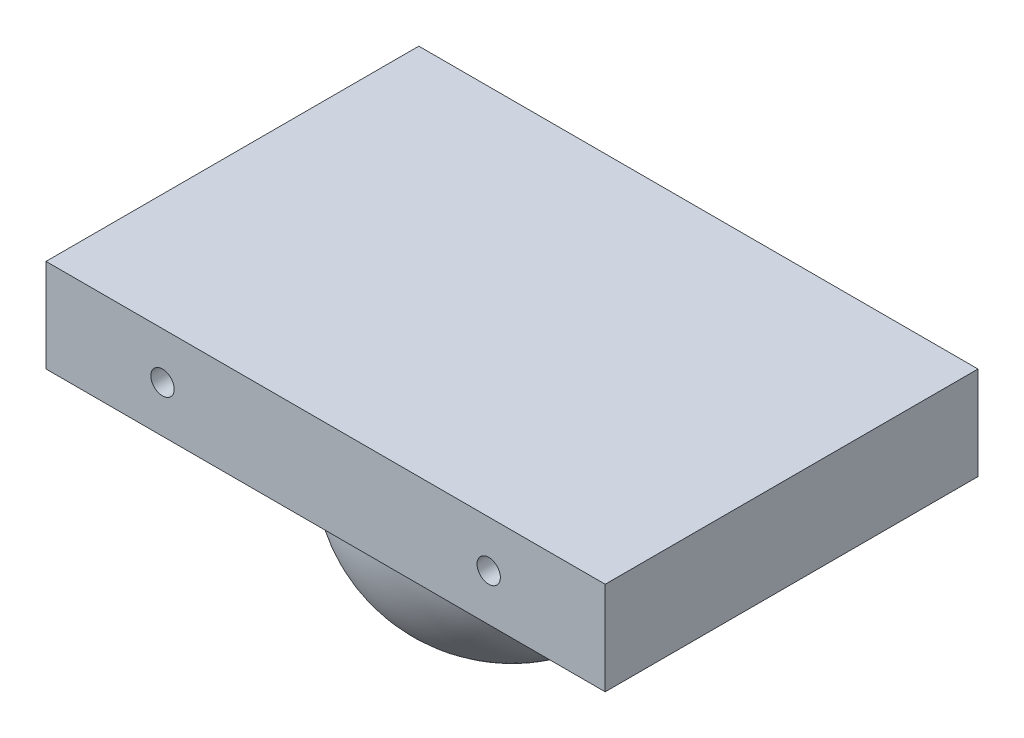
ISO-10303-21;
HEADER;
FILE_DESCRIPTION(('STEP AP214'),'2;1');
FILE_NAME('part.step','',(''),(''),'','','');
FILE_SCHEMA(('AUTOMOTIVE_DESIGN { 1 0 10303 214 1 1 1 1 }'));
ENDSEC;
DATA;
#1=APPLICATION_CONTEXT('core data for automotive mechanical design processes');
#2=APPLICATION_PROTOCOL_DEFINITION('international standard','automotive_design',2000,#1);
#3=PRODUCT_CONTEXT('',#1,'mechanical');
#4=PRODUCT('Part','Part','',(#3));
#5=PRODUCT_RELATED_PRODUCT_CATEGORY('part','',(#4));
#6=PRODUCT_DEFINITION_FORMATION('','',#4);
#7=PRODUCT_DEFINITION_CONTEXT('part definition',#1,'design');
#8=PRODUCT_DEFINITION('design','',#6,#7);
#9=PRODUCT_DEFINITION_SHAPE('','',#8);
#10=(LENGTH_UNIT() NAMED_UNIT(*) SI_UNIT(.MILLI.,.METRE.));
#11=(NAMED_UNIT(*) PLANE_ANGLE_UNIT() SI_UNIT($,.RADIAN.));
#12=(NAMED_UNIT(*) SI_UNIT($,.STERADIAN.) SOLID_ANGLE_UNIT());
#13=UNCERTAINTY_MEASURE_WITH_UNIT(LENGTH_MEASURE(1.E-05),#10,'distance_accuracy_value','');
#14=(GEOMETRIC_REPRESENTATION_CONTEXT(3) GLOBAL_UNCERTAINTY_ASSIGNED_CONTEXT((#13)) GLOBAL_UNIT_ASSIGNED_CONTEXT((#10,
#11,#12)) REPRESENTATION_CONTEXT('',''));
#15=CARTESIAN_POINT('',(0.,0.,0.));
#16=DIRECTION('',(0.,0.,1.));
#17=DIRECTION('',(1.,0.,0.));
#18=AXIS2_PLACEMENT_3D('',#15,#16,#17);
#19=CARTESIAN_POINT('',(-18.9349112426035,5.,-10.2366863905325));
#20=DIRECTION('',(1.,0.,0.));
#21=DIRECTION('',(0.,0.,-1.));
#22=AXIS2_PLACEMENT_3D('',#19,#20,#21);
#23=PLANE('',#22);
#24=DIRECTION('',(0.,0.,1.));
#25=VECTOR('',#24,1.);
#26=CARTESIAN_POINT('',(-18.9349112426035,0.,-10.2366863905325));
#27=LINE('',#26,#25);
#28=CARTESIAN_POINT('',(-18.9349112426035,0.,-10.2366863905325));
#29=VERTEX_POINT('',#28);
#30=CARTESIAN_POINT('',(-18.9349112426035,0.,9.76331360946745));
#31=VERTEX_POINT('',#30);
#32=EDGE_CURVE('E111',#29,#31,#27,.T.);
#33=ORIENTED_EDGE('',*,*,#32,.T.);
#34=DIRECTION('',(0.,-1.,0.));
#35=VECTOR('',#34,1.);
#36=CARTESIAN_POINT('',(-18.9349112426035,5.,9.76331360946745));
#37=LINE('',#36,#35);
#38=CARTESIAN_POINT('',(-18.9349112426035,5.,9.76331360946745));
#39=VERTEX_POINT('',#38);
#40=EDGE_CURVE('E43',#39,#31,#37,.T.);
#41=ORIENTED_EDGE('',*,*,#40,.F.);
#42=DIRECTION('',(0.,0.,1.));
#43=VECTOR('',#42,1.);
#44=CARTESIAN_POINT('',(-18.9349112426035,5.,-10.2366863905325));
#45=LINE('',#44,#43);
#46=CARTESIAN_POINT('',(-18.9349112426035,5.,-10.2366863905325));
#47=VERTEX_POINT('',#46);
#48=EDGE_CURVE('E94',#47,#39,#45,.T.);
#49=ORIENTED_EDGE('',*,*,#48,.F.);
#50=DIRECTION('',(0.,-1.,0.));
#51=VECTOR('',#50,1.);
#52=CARTESIAN_POINT('',(-18.9349112426035,5.,-10.2366863905325));
#53=LINE('',#52,#51);
#54=EDGE_CURVE('E107',#47,#29,#53,.T.);
#55=ORIENTED_EDGE('',*,*,#54,.T.);
#56=EDGE_LOOP('',(#33,#41,#49,#55));
#57=FACE_BOUND('',#56,.T.);
#58=ADVANCED_FACE('F40',(#57),#23,.F.);
#59=CARTESIAN_POINT('',(-18.9349112426035,5.,9.76331360946745));
#60=DIRECTION('',(0.,0.,-1.));
#61=DIRECTION('',(-1.,0.,0.));
#62=AXIS2_PLACEMENT_3D('',#59,#60,#61);
#63=PLANE('',#62);
#64=CARTESIAN_POINT('',(-12.6849112426035,2.5,9.76331360946745));
#65=DIRECTION('',(0.,0.,1.));
#66=DIRECTION('',(1.,0.,0.));
#67=AXIS2_PLACEMENT_3D('',#64,#65,#66);
#68=CIRCLE('',#67,0.625000000000001);
#69=CARTESIAN_POINT('',(-12.0599112426035,2.5,9.76331360946745));
#70=VERTEX_POINT('',#69);
#71=EDGE_CURVE('E148',#70,#70,#68,.T.);
#72=ORIENTED_EDGE('',*,*,#71,.F.);
#73=EDGE_LOOP('',(#72));
#74=FACE_BOUND('',#73,.T.);
#75=CARTESIAN_POINT('',(4.81508875739647,2.5,9.76331360946745));
#76=DIRECTION('',(0.,0.,1.));
#77=DIRECTION('',(1.,0.,0.));
#78=AXIS2_PLACEMENT_3D('',#75,#76,#77);
#79=CIRCLE('',#78,0.625);
#80=CARTESIAN_POINT('',(5.44008875739647,2.5,9.76331360946745));
#81=VERTEX_POINT('',#80);
#82=EDGE_CURVE('E140',#81,#81,#79,.T.);
#83=ORIENTED_EDGE('',*,*,#82,.F.);
#84=EDGE_LOOP('',(#83));
#85=FACE_BOUND('',#84,.T.);
#86=DIRECTION('',(1.,0.,0.));
#87=VECTOR('',#86,1.);
#88=CARTESIAN_POINT('',(-18.9349112426035,0.,9.76331360946745));
#89=LINE('',#88,#87);
#90=CARTESIAN_POINT('',(11.0650887573965,0.,9.76331360946745));
#91=VERTEX_POINT('',#90);
#92=EDGE_CURVE('E100',#31,#91,#89,.T.);
#93=ORIENTED_EDGE('',*,*,#92,.T.);
#94=DIRECTION('',(0.,-1.,0.));
#95=VECTOR('',#94,1.);
#96=CARTESIAN_POINT('',(11.0650887573965,5.,9.76331360946745));
#97=LINE('',#96,#95);
#98=CARTESIAN_POINT('',(11.0650887573965,5.,9.76331360946745));
#99=VERTEX_POINT('',#98);
#100=EDGE_CURVE('E98',#99,#91,#97,.T.);
#101=ORIENTED_EDGE('',*,*,#100,.F.);
#102=DIRECTION('',(1.,0.,0.));
#103=VECTOR('',#102,1.);
#104=CARTESIAN_POINT('',(-18.9349112426035,5.,9.76331360946745));
#105=LINE('',#104,#103);
#106=EDGE_CURVE('E89',#39,#99,#105,.T.);
#107=ORIENTED_EDGE('',*,*,#106,.F.);
#108=ORIENTED_EDGE('',*,*,#40,.T.);
#109=EDGE_LOOP('',(#93,#101,#107,#108));
#110=FACE_BOUND('',#109,.T.);
#111=ADVANCED_FACE('F99',(#74,#85,#110),#63,.F.);
#112=CARTESIAN_POINT('',(11.0650887573965,5.,-10.2366863905325));
#113=DIRECTION('',(-1.,0.,0.));
#114=DIRECTION('',(0.,0.,1.));
#115=AXIS2_PLACEMENT_3D('',#112,#113,#114);
#116=PLANE('',#115);
#117=DIRECTION('',(0.,0.,-1.));
#118=VECTOR('',#117,1.);
#119=CARTESIAN_POINT('',(11.0650887573965,0.,-10.2366863905325));
#120=LINE('',#119,#118);
#121=CARTESIAN_POINT('',(11.0650887573965,0.,-10.2366863905325));
#122=VERTEX_POINT('',#121);
#123=EDGE_CURVE('E75',#91,#122,#120,.T.);
#124=ORIENTED_EDGE('',*,*,#123,.T.);
#125=DIRECTION('',(0.,-1.,0.));
#126=VECTOR('',#125,1.);
#127=CARTESIAN_POINT('',(11.0650887573965,5.,-10.2366863905325));
#128=LINE('',#127,#126);
#129=CARTESIAN_POINT('',(11.0650887573965,5.,-10.2366863905325));
#130=VERTEX_POINT('',#129);
#131=EDGE_CURVE('E102',#130,#122,#128,.T.);
#132=ORIENTED_EDGE('',*,*,#131,.F.);
#133=DIRECTION('',(0.,0.,-1.));
#134=VECTOR('',#133,1.);
#135=CARTESIAN_POINT('',(11.0650887573965,5.,-10.2366863905325));
#136=LINE('',#135,#134);
#137=EDGE_CURVE('E92',#99,#130,#136,.T.);
#138=ORIENTED_EDGE('',*,*,#137,.F.);
#139=ORIENTED_EDGE('',*,*,#100,.T.);
#140=EDGE_LOOP('',(#124,#132,#138,#139));
#141=FACE_BOUND('',#140,.T.);
#142=ADVANCED_FACE('F103',(#141),#116,.F.);
#143=CARTESIAN_POINT('',(-18.9349112426035,5.,-10.2366863905325));
#144=DIRECTION('',(0.,0.,1.));
#145=DIRECTION('',(1.,0.,0.));
#146=AXIS2_PLACEMENT_3D('',#143,#144,#145);
#147=PLANE('',#146);
#148=CARTESIAN_POINT('',(-12.6849112426035,2.5,-10.2366863905325));
#149=DIRECTION('',(0.,0.,1.));
#150=DIRECTION('',(1.,0.,0.));
#151=AXIS2_PLACEMENT_3D('',#148,#149,#150);
#152=CIRCLE('',#151,0.625000000000001);
#153=CARTESIAN_POINT('',(-12.0599112426035,2.5,-10.2366863905325));
#154=VERTEX_POINT('',#153);
#155=EDGE_CURVE('E139',#154,#154,#152,.T.);
#156=ORIENTED_EDGE('',*,*,#155,.T.);
#157=EDGE_LOOP('',(#156));
#158=FACE_BOUND('',#157,.T.);
#159=CARTESIAN_POINT('',(4.81508875739647,2.5,-10.2366863905325));
#160=DIRECTION('',(0.,0.,1.));
#161=DIRECTION('',(1.,0.,0.));
#162=AXIS2_PLACEMENT_3D('',#159,#160,#161);
#163=CIRCLE('',#162,0.625);
#164=CARTESIAN_POINT('',(5.44008875739647,2.5,-10.2366863905325));
#165=VERTEX_POINT('',#164);
#166=EDGE_CURVE('E144',#165,#165,#163,.T.);
#167=ORIENTED_EDGE('',*,*,#166,.T.);
#168=EDGE_LOOP('',(#167));
#169=FACE_BOUND('',#168,.T.);
#170=DIRECTION('',(-1.,0.,0.));
#171=VECTOR('',#170,1.);
#172=CARTESIAN_POINT('',(-18.9349112426035,0.,-10.2366863905325));
#173=LINE('',#172,#171);
#174=EDGE_CURVE('E81',#122,#29,#173,.T.);
#175=ORIENTED_EDGE('',*,*,#174,.T.);
#176=ORIENTED_EDGE('',*,*,#54,.F.);
#177=DIRECTION('',(-1.,0.,0.));
#178=VECTOR('',#177,1.);
#179=CARTESIAN_POINT('',(-18.9349112426035,5.,-10.2366863905325));
#180=LINE('',#179,#178);
#181=EDGE_CURVE('E58',#130,#47,#180,.T.);
#182=ORIENTED_EDGE('',*,*,#181,.F.);
#183=ORIENTED_EDGE('',*,*,#131,.T.);
#184=EDGE_LOOP('',(#175,#176,#182,#183));
#185=FACE_BOUND('',#184,.T.);
#186=ADVANCED_FACE('F125',(#158,#169,#185),#147,.F.);
#187=CARTESIAN_POINT('',(0.,5.,0.));
#188=DIRECTION('',(0.,1.,0.));
#189=DIRECTION('',(0.,0.,1.));
#190=AXIS2_PLACEMENT_3D('',#187,#188,#189);
#191=PLANE('',#190);
#192=ORIENTED_EDGE('',*,*,#48,.T.);
#193=ORIENTED_EDGE('',*,*,#106,.T.);
#194=ORIENTED_EDGE('',*,*,#137,.T.);
#195=ORIENTED_EDGE('',*,*,#181,.T.);
#196=EDGE_LOOP('',(#192,#193,#194,#195));
#197=FACE_BOUND('',#196,.T.);
#198=ADVANCED_FACE('F90',(#197),#191,.T.);
#199=CARTESIAN_POINT('',(0.,0.,0.));
#200=DIRECTION('',(0.,1.,0.));
#201=DIRECTION('',(0.,0.,1.));
#202=AXIS2_PLACEMENT_3D('',#199,#200,#201);
#203=PLANE('',#202);
#204=CARTESIAN_POINT('',(-3.93491124260353,0.,-0.236686390532551));
#205=DIRECTION('',(0.,-1.,0.));
#206=DIRECTION('',(0.,0.,-1.));
#207=AXIS2_PLACEMENT_3D('',#204,#205,#206);
#208=CIRCLE('',#207,5.);
#209=CARTESIAN_POINT('',(-3.93491124260353,0.,-5.23668639053255));
#210=VERTEX_POINT('',#209);
#211=EDGE_CURVE('E11',#210,#210,#208,.T.);
#212=ORIENTED_EDGE('',*,*,#211,.F.);
#213=EDGE_LOOP('',(#212));
#214=FACE_BOUND('',#213,.T.);
#215=ORIENTED_EDGE('',*,*,#32,.F.);
#216=ORIENTED_EDGE('',*,*,#174,.F.);
#217=ORIENTED_EDGE('',*,*,#123,.F.);
#218=ORIENTED_EDGE('',*,*,#92,.F.);
#219=EDGE_LOOP('',(#215,#216,#217,#218));
#220=FACE_BOUND('',#219,.T.);
#221=ADVANCED_FACE('F128',(#214,#220),#203,.F.);
#222=CARTESIAN_POINT('',(-3.93491124260353,-2.,-0.236686390532551));
#223=DIRECTION('',(0.,1.,0.));
#224=DIRECTION('',(0.,0.,1.));
#225=AXIS2_PLACEMENT_3D('',#222,#223,#224);
#226=CYLINDRICAL_SURFACE('',#225,5.);
#227=CARTESIAN_POINT('',(-3.93491124260353,-2.,-0.236686390532551));
#228=DIRECTION('',(0.,-1.,0.));
#229=DIRECTION('',(0.,0.,-1.));
#230=AXIS2_PLACEMENT_3D('',#227,#228,#229);
#231=CIRCLE('',#230,5.);
#232=CARTESIAN_POINT('',(-3.93491124260353,-2.,-5.23668639053255));
#233=VERTEX_POINT('',#232);
#234=EDGE_CURVE('E115',#233,#233,#231,.T.);
#235=ORIENTED_EDGE('',*,*,#234,.F.);
#236=EDGE_LOOP('',(#235));
#237=FACE_BOUND('',#236,.T.);
#238=ORIENTED_EDGE('',*,*,#211,.T.);
#239=EDGE_LOOP('',(#238));
#240=FACE_BOUND('',#239,.T.);
#241=ADVANCED_FACE('F212',(#237,#240),#226,.T.);
#242=CARTESIAN_POINT('',(-3.93491124260353,-2.,-0.236686390532551));
#243=DIRECTION('',(0.,0.,-1.));
#244=DIRECTION('',(1.,0.,0.));
#245=AXIS2_PLACEMENT_3D('',#242,#243,#244);
#246=SPHERICAL_SURFACE('',#245,7.5);
#247=CARTESIAN_POINT('',(-3.93491124260353,-2.,-0.236686390532551));
#248=DIRECTION('',(0.,1.,0.));
#249=DIRECTION('',(0.,0.,-1.));
#250=AXIS2_PLACEMENT_3D('',#247,#248,#249);
#251=SPHERICAL_SURFACE('',#250,7.5);
#252=CARTESIAN_POINT('',(-3.93491124260353,-2.,-0.236686390532551));
#253=DIRECTION('',(0.,1.,0.));
#254=DIRECTION('',(0.,0.,-1.));
#255=AXIS2_PLACEMENT_3D('',#252,#253,#254);
#256=CIRCLE('',#255,7.5);
#257=CARTESIAN_POINT('',(-3.93491124260353,-2.,-7.73668639053255));
#258=VERTEX_POINT('',#257);
#259=EDGE_CURVE('E135',#258,#258,#256,.T.);
#260=ORIENTED_EDGE('',*,*,#259,.F.);
#261=EDGE_LOOP('',(#260));
#262=FACE_BOUND('',#261,.T.);
#263=ADVANCED_FACE('F176',(#262),#251,.T.);
#264=CARTESIAN_POINT('',(-3.93491124260353,-2.,-0.236686390532551));
#265=DIRECTION('',(0.,1.,0.));
#266=DIRECTION('',(0.,0.,-1.));
#267=AXIS2_PLACEMENT_3D('',#264,#265,#266);
#268=PLANE('',#267);
#269=ORIENTED_EDGE('',*,*,#234,.T.);
#270=EDGE_LOOP('',(#269));
#271=FACE_BOUND('',#270,.T.);
#272=ORIENTED_EDGE('',*,*,#259,.T.);
#273=EDGE_LOOP('',(#272));
#274=FACE_BOUND('',#273,.T.);
#275=ADVANCED_FACE('F170',(#271,#274),#268,.T.);
#276=CARTESIAN_POINT('',(4.81508875739647,2.5,-10.2366863905325));
#277=DIRECTION('',(0.,0.,1.));
#278=DIRECTION('',(1.,0.,0.));
#279=AXIS2_PLACEMENT_3D('',#276,#277,#278);
#280=CYLINDRICAL_SURFACE('',#279,0.625);
#281=ORIENTED_EDGE('',*,*,#166,.F.);
#282=EDGE_LOOP('',(#281));
#283=FACE_BOUND('',#282,.T.);
#284=ORIENTED_EDGE('',*,*,#82,.T.);
#285=EDGE_LOOP('',(#284));
#286=FACE_BOUND('',#285,.T.);
#287=ADVANCED_FACE('F161',(#283,#286),#280,.F.);
#288=CARTESIAN_POINT('',(-12.6849112426035,2.5,-10.2366863905325));
#289=DIRECTION('',(0.,0.,1.));
#290=DIRECTION('',(1.,0.,0.));
#291=AXIS2_PLACEMENT_3D('',#288,#289,#290);
#292=CYLINDRICAL_SURFACE('',#291,0.625000000000001);
#293=ORIENTED_EDGE('',*,*,#155,.F.);
#294=EDGE_LOOP('',(#293));
#295=FACE_BOUND('',#294,.T.);
#296=ORIENTED_EDGE('',*,*,#71,.T.);
#297=EDGE_LOOP('',(#296));
#298=FACE_BOUND('',#297,.T.);
#299=ADVANCED_FACE('F158',(#295,#298),#292,.F.);
#300=CLOSED_SHELL('',(#58,#111,#142,#186,#198,#221,#241,#263,#275,#287,#299));
#301=MANIFOLD_SOLID_BREP('B2',#300);
#302=ADVANCED_BREP_SHAPE_REPRESENTATION('',(#18,#301),#14);
#303=SHAPE_DEFINITION_REPRESENTATION(#9,#302);
ENDSEC;
END-ISO-10303-21;
